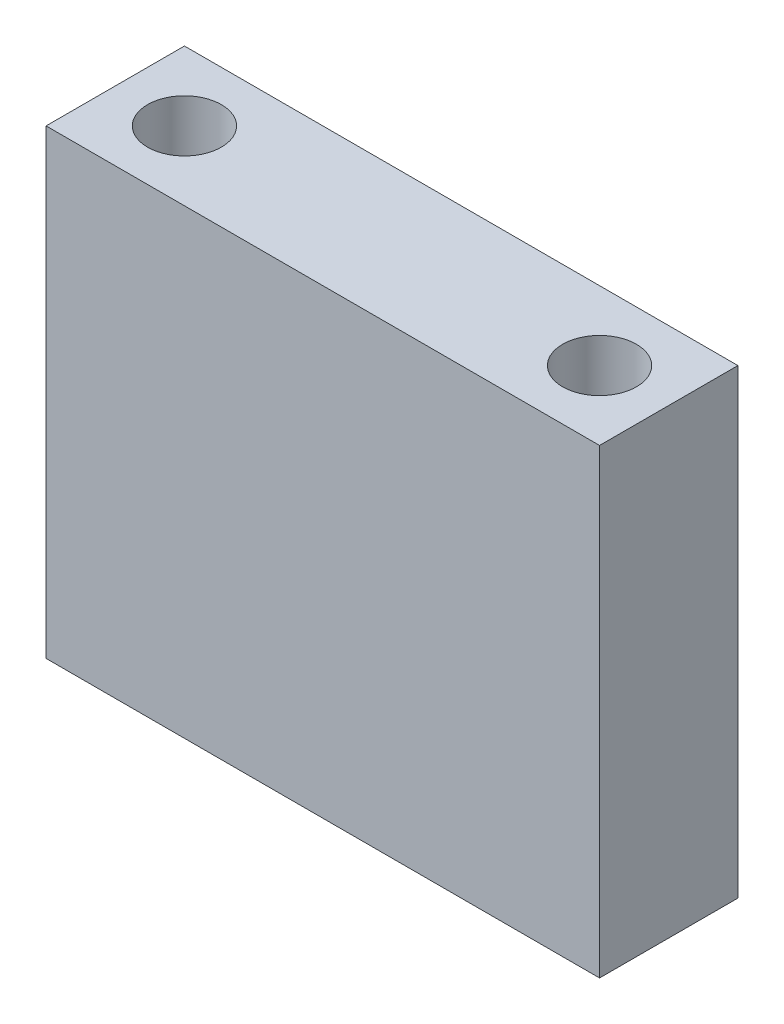
ISO-10303-21;
HEADER;
FILE_DESCRIPTION(('STEP AP214'),'2;1');
FILE_NAME('part.step','',(''),(''),'','','');
FILE_SCHEMA(('AUTOMOTIVE_DESIGN { 1 0 10303 214 1 1 1 1 }'));
ENDSEC;
DATA;
#1=APPLICATION_CONTEXT('core data for automotive mechanical design processes');
#2=APPLICATION_PROTOCOL_DEFINITION('international standard','automotive_design',2000,#1);
#3=PRODUCT_CONTEXT('',#1,'mechanical');
#4=PRODUCT('Part','Part','',(#3));
#5=PRODUCT_RELATED_PRODUCT_CATEGORY('part','',(#4));
#6=PRODUCT_DEFINITION_FORMATION('','',#4);
#7=PRODUCT_DEFINITION_CONTEXT('part definition',#1,'design');
#8=PRODUCT_DEFINITION('design','',#6,#7);
#9=PRODUCT_DEFINITION_SHAPE('','',#8);
#10=(LENGTH_UNIT() NAMED_UNIT(*) SI_UNIT(.MILLI.,.METRE.));
#11=(NAMED_UNIT(*) PLANE_ANGLE_UNIT() SI_UNIT($,.RADIAN.));
#12=(NAMED_UNIT(*) SI_UNIT($,.STERADIAN.) SOLID_ANGLE_UNIT());
#13=UNCERTAINTY_MEASURE_WITH_UNIT(LENGTH_MEASURE(1.E-05),#10,'distance_accuracy_value','');
#14=(GEOMETRIC_REPRESENTATION_CONTEXT(3) GLOBAL_UNCERTAINTY_ASSIGNED_CONTEXT((#13)) GLOBAL_UNIT_ASSIGNED_CONTEXT((#10,
#11,#12)) REPRESENTATION_CONTEXT('',''));
#15=CARTESIAN_POINT('',(0.,0.,0.));
#16=DIRECTION('',(0.,0.,1.));
#17=DIRECTION('',(1.,0.,0.));
#18=AXIS2_PLACEMENT_3D('',#15,#16,#17);
#19=CARTESIAN_POINT('',(19.05,15.875,9.525));
#20=DIRECTION('',(-1.,0.,0.));
#21=DIRECTION('',(0.,-1.,0.));
#22=AXIS2_PLACEMENT_3D('',#19,#20,#21);
#23=PLANE('',#22);
#24=DIRECTION('',(0.,1.,0.));
#25=VECTOR('',#24,1.);
#26=CARTESIAN_POINT('',(19.05,15.875,0.));
#27=LINE('',#26,#25);
#28=CARTESIAN_POINT('',(19.05,-15.875,0.));
#29=VERTEX_POINT('',#28);
#30=CARTESIAN_POINT('',(19.05,15.875,0.));
#31=VERTEX_POINT('',#30);
#32=EDGE_CURVE('E111',#29,#31,#27,.T.);
#33=ORIENTED_EDGE('',*,*,#32,.T.);
#34=DIRECTION('',(0.,0.,-1.));
#35=VECTOR('',#34,1.);
#36=CARTESIAN_POINT('',(19.05,15.875,9.525));
#37=LINE('',#36,#35);
#38=CARTESIAN_POINT('',(19.05,15.875,9.525));
#39=VERTEX_POINT('',#38);
#40=EDGE_CURVE('E11',#39,#31,#37,.T.);
#41=ORIENTED_EDGE('',*,*,#40,.F.);
#42=DIRECTION('',(0.,1.,0.));
#43=VECTOR('',#42,1.);
#44=CARTESIAN_POINT('',(19.05,15.875,9.525));
#45=LINE('',#44,#43);
#46=CARTESIAN_POINT('',(19.05,-15.875,9.525));
#47=VERTEX_POINT('',#46);
#48=EDGE_CURVE('E99',#47,#39,#45,.T.);
#49=ORIENTED_EDGE('',*,*,#48,.F.);
#50=DIRECTION('',(0.,0.,-1.));
#51=VECTOR('',#50,1.);
#52=CARTESIAN_POINT('',(19.05,-15.875,9.525));
#53=LINE('',#52,#51);
#54=EDGE_CURVE('E107',#47,#29,#53,.T.);
#55=ORIENTED_EDGE('',*,*,#54,.T.);
#56=EDGE_LOOP('',(#33,#41,#49,#55));
#57=FACE_BOUND('',#56,.T.);
#58=ADVANCED_FACE('F48',(#57),#23,.F.);
#59=CARTESIAN_POINT('',(-19.05,15.875,9.525));
#60=DIRECTION('',(0.,-1.,0.));
#61=DIRECTION('',(0.,0.,-1.));
#62=AXIS2_PLACEMENT_3D('',#59,#60,#61);
#63=PLANE('',#62);
#64=CARTESIAN_POINT('',(-14.2875,15.875,4.7625));
#65=DIRECTION('',(0.,1.,0.));
#66=DIRECTION('',(0.,0.,1.));
#67=AXIS2_PLACEMENT_3D('',#64,#65,#66);
#68=CIRCLE('',#67,2.54);
#69=CARTESIAN_POINT('',(-14.2875,15.875,7.3025));
#70=VERTEX_POINT('',#69);
#71=EDGE_CURVE('E131',#70,#70,#68,.T.);
#72=ORIENTED_EDGE('',*,*,#71,.F.);
#73=EDGE_LOOP('',(#72));
#74=FACE_BOUND('',#73,.T.);
#75=CARTESIAN_POINT('',(14.2875,15.875,4.7625));
#76=DIRECTION('',(0.,1.,0.));
#77=DIRECTION('',(0.,0.,1.));
#78=AXIS2_PLACEMENT_3D('',#75,#76,#77);
#79=CIRCLE('',#78,2.54);
#80=CARTESIAN_POINT('',(14.2875,15.875,7.3025));
#81=VERTEX_POINT('',#80);
#82=EDGE_CURVE('E128',#81,#81,#79,.T.);
#83=ORIENTED_EDGE('',*,*,#82,.F.);
#84=EDGE_LOOP('',(#83));
#85=FACE_BOUND('',#84,.T.);
#86=DIRECTION('',(-1.,0.,0.));
#87=VECTOR('',#86,1.);
#88=CARTESIAN_POINT('',(-19.05,15.875,0.));
#89=LINE('',#88,#87);
#90=CARTESIAN_POINT('',(-19.05,15.875,0.));
#91=VERTEX_POINT('',#90);
#92=EDGE_CURVE('E103',#31,#91,#89,.T.);
#93=ORIENTED_EDGE('',*,*,#92,.T.);
#94=DIRECTION('',(0.,0.,-1.));
#95=VECTOR('',#94,1.);
#96=CARTESIAN_POINT('',(-19.05,15.875,9.525));
#97=LINE('',#96,#95);
#98=CARTESIAN_POINT('',(-19.05,15.875,9.525));
#99=VERTEX_POINT('',#98);
#100=EDGE_CURVE('E56',#99,#91,#97,.T.);
#101=ORIENTED_EDGE('',*,*,#100,.F.);
#102=DIRECTION('',(-1.,0.,0.));
#103=VECTOR('',#102,1.);
#104=CARTESIAN_POINT('',(-19.05,15.875,9.525));
#105=LINE('',#104,#103);
#106=EDGE_CURVE('E94',#39,#99,#105,.T.);
#107=ORIENTED_EDGE('',*,*,#106,.F.);
#108=ORIENTED_EDGE('',*,*,#40,.T.);
#109=EDGE_LOOP('',(#93,#101,#107,#108));
#110=FACE_BOUND('',#109,.T.);
#111=ADVANCED_FACE('F102',(#74,#85,#110),#63,.F.);
#112=CARTESIAN_POINT('',(-19.05,15.875,9.525));
#113=DIRECTION('',(1.,0.,0.));
#114=DIRECTION('',(0.,1.,0.));
#115=AXIS2_PLACEMENT_3D('',#112,#113,#114);
#116=PLANE('',#115);
#117=DIRECTION('',(0.,-1.,0.));
#118=VECTOR('',#117,1.);
#119=CARTESIAN_POINT('',(-19.05,15.875,0.));
#120=LINE('',#119,#118);
#121=CARTESIAN_POINT('',(-19.05,-15.875,0.));
#122=VERTEX_POINT('',#121);
#123=EDGE_CURVE('E81',#91,#122,#120,.T.);
#124=ORIENTED_EDGE('',*,*,#123,.T.);
#125=DIRECTION('',(0.,0.,-1.));
#126=VECTOR('',#125,1.);
#127=CARTESIAN_POINT('',(-19.05,-15.875,9.525));
#128=LINE('',#127,#126);
#129=CARTESIAN_POINT('',(-19.05,-15.875,9.525));
#130=VERTEX_POINT('',#129);
#131=EDGE_CURVE('E104',#130,#122,#128,.T.);
#132=ORIENTED_EDGE('',*,*,#131,.F.);
#133=DIRECTION('',(0.,-1.,0.));
#134=VECTOR('',#133,1.);
#135=CARTESIAN_POINT('',(-19.05,15.875,9.525));
#136=LINE('',#135,#134);
#137=EDGE_CURVE('E97',#99,#130,#136,.T.);
#138=ORIENTED_EDGE('',*,*,#137,.F.);
#139=ORIENTED_EDGE('',*,*,#100,.T.);
#140=EDGE_LOOP('',(#124,#132,#138,#139));
#141=FACE_BOUND('',#140,.T.);
#142=ADVANCED_FACE('F105',(#141),#116,.F.);
#143=CARTESIAN_POINT('',(-19.05,-15.875,9.525));
#144=DIRECTION('',(0.,1.,0.));
#145=DIRECTION('',(0.,0.,1.));
#146=AXIS2_PLACEMENT_3D('',#143,#144,#145);
#147=PLANE('',#146);
#148=CARTESIAN_POINT('',(-14.2875,-15.875,4.7625));
#149=DIRECTION('',(0.,1.,0.));
#150=DIRECTION('',(0.,0.,1.));
#151=AXIS2_PLACEMENT_3D('',#148,#149,#150);
#152=CIRCLE('',#151,2.54);
#153=CARTESIAN_POINT('',(-14.2875,-15.875,7.3025));
#154=VERTEX_POINT('',#153);
#155=EDGE_CURVE('E114',#154,#154,#152,.T.);
#156=ORIENTED_EDGE('',*,*,#155,.T.);
#157=EDGE_LOOP('',(#156));
#158=FACE_BOUND('',#157,.T.);
#159=CARTESIAN_POINT('',(14.2875,-15.875,4.7625));
#160=DIRECTION('',(0.,1.,0.));
#161=DIRECTION('',(0.,0.,1.));
#162=AXIS2_PLACEMENT_3D('',#159,#160,#161);
#163=CIRCLE('',#162,2.54);
#164=CARTESIAN_POINT('',(14.2875,-15.875,7.3025));
#165=VERTEX_POINT('',#164);
#166=EDGE_CURVE('E125',#165,#165,#163,.T.);
#167=ORIENTED_EDGE('',*,*,#166,.T.);
#168=EDGE_LOOP('',(#167));
#169=FACE_BOUND('',#168,.T.);
#170=DIRECTION('',(1.,0.,0.));
#171=VECTOR('',#170,1.);
#172=CARTESIAN_POINT('',(-19.05,-15.875,0.));
#173=LINE('',#172,#171);
#174=EDGE_CURVE('E87',#122,#29,#173,.T.);
#175=ORIENTED_EDGE('',*,*,#174,.T.);
#176=ORIENTED_EDGE('',*,*,#54,.F.);
#177=DIRECTION('',(1.,0.,0.));
#178=VECTOR('',#177,1.);
#179=CARTESIAN_POINT('',(-19.05,-15.875,9.525));
#180=LINE('',#179,#178);
#181=EDGE_CURVE('E64',#130,#47,#180,.T.);
#182=ORIENTED_EDGE('',*,*,#181,.F.);
#183=ORIENTED_EDGE('',*,*,#131,.T.);
#184=EDGE_LOOP('',(#175,#176,#182,#183));
#185=FACE_BOUND('',#184,.T.);
#186=ADVANCED_FACE('F119',(#158,#169,#185),#147,.F.);
#187=CARTESIAN_POINT('',(0.,0.,9.525));
#188=DIRECTION('',(0.,0.,1.));
#189=DIRECTION('',(1.,0.,0.));
#190=AXIS2_PLACEMENT_3D('',#187,#188,#189);
#191=PLANE('',#190);
#192=ORIENTED_EDGE('',*,*,#48,.T.);
#193=ORIENTED_EDGE('',*,*,#106,.T.);
#194=ORIENTED_EDGE('',*,*,#137,.T.);
#195=ORIENTED_EDGE('',*,*,#181,.T.);
#196=EDGE_LOOP('',(#192,#193,#194,#195));
#197=FACE_BOUND('',#196,.T.);
#198=ADVANCED_FACE('F95',(#197),#191,.T.);
#199=CARTESIAN_POINT('',(0.,0.,0.));
#200=DIRECTION('',(0.,0.,1.));
#201=DIRECTION('',(1.,0.,0.));
#202=AXIS2_PLACEMENT_3D('',#199,#200,#201);
#203=PLANE('',#202);
#204=ORIENTED_EDGE('',*,*,#32,.F.);
#205=ORIENTED_EDGE('',*,*,#174,.F.);
#206=ORIENTED_EDGE('',*,*,#123,.F.);
#207=ORIENTED_EDGE('',*,*,#92,.F.);
#208=EDGE_LOOP('',(#204,#205,#206,#207));
#209=FACE_BOUND('',#208,.T.);
#210=ADVANCED_FACE('F122',(#209),#203,.F.);
#211=CARTESIAN_POINT('',(14.2875,-15.875,4.7625));
#212=DIRECTION('',(0.,1.,0.));
#213=DIRECTION('',(0.,0.,1.));
#214=AXIS2_PLACEMENT_3D('',#211,#212,#213);
#215=CYLINDRICAL_SURFACE('',#214,2.54);
#216=ORIENTED_EDGE('',*,*,#166,.F.);
#217=EDGE_LOOP('',(#216));
#218=FACE_BOUND('',#217,.T.);
#219=ORIENTED_EDGE('',*,*,#82,.T.);
#220=EDGE_LOOP('',(#219));
#221=FACE_BOUND('',#220,.T.);
#222=ADVANCED_FACE('F142',(#218,#221),#215,.F.);
#223=CARTESIAN_POINT('',(-14.2875,-15.875,4.7625));
#224=DIRECTION('',(0.,1.,0.));
#225=DIRECTION('',(0.,0.,1.));
#226=AXIS2_PLACEMENT_3D('',#223,#224,#225);
#227=CYLINDRICAL_SURFACE('',#226,2.54);
#228=ORIENTED_EDGE('',*,*,#155,.F.);
#229=EDGE_LOOP('',(#228));
#230=FACE_BOUND('',#229,.T.);
#231=ORIENTED_EDGE('',*,*,#71,.T.);
#232=EDGE_LOOP('',(#231));
#233=FACE_BOUND('',#232,.T.);
#234=ADVANCED_FACE('F139',(#230,#233),#227,.F.);
#235=CLOSED_SHELL('',(#58,#111,#142,#186,#198,#210,#222,#234));
#236=MANIFOLD_SOLID_BREP('B2',#235);
#237=ADVANCED_BREP_SHAPE_REPRESENTATION('',(#18,#236),#14);
#238=SHAPE_DEFINITION_REPRESENTATION(#9,#237);
ENDSEC;
END-ISO-10303-21;
